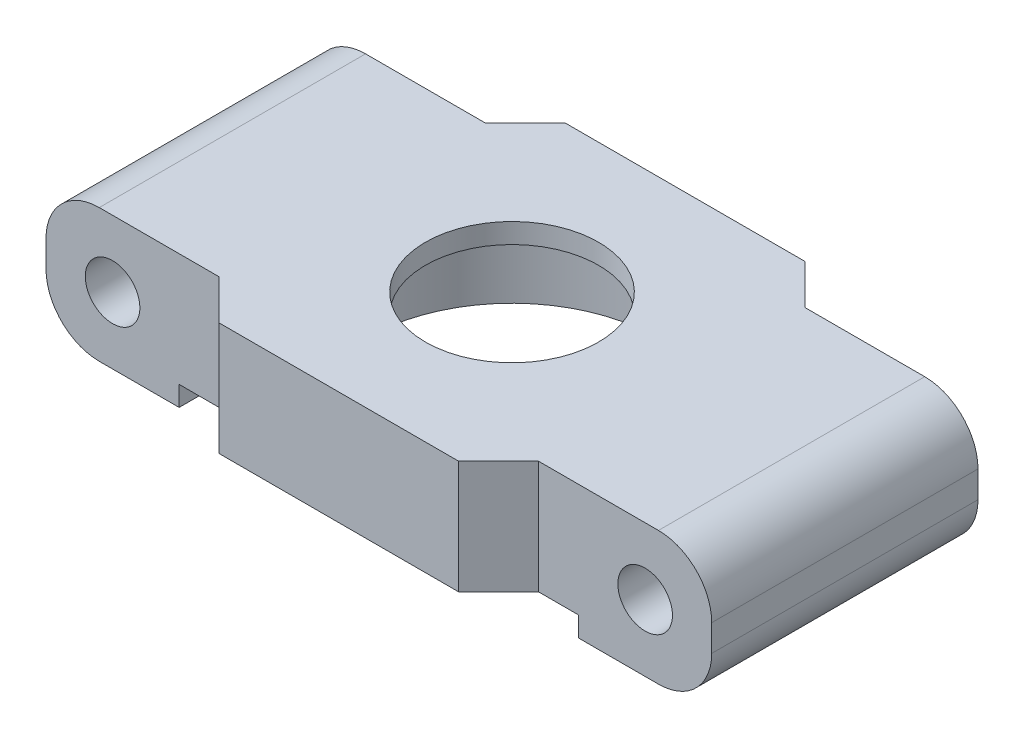
ISO-10303-21;
HEADER;
FILE_DESCRIPTION(('STEP AP214'),'2;1');
FILE_NAME('part.step','',(''),(''),'','','');
FILE_SCHEMA(('AUTOMOTIVE_DESIGN { 1 0 10303 214 1 1 1 1 }'));
ENDSEC;
DATA;
#1=APPLICATION_CONTEXT('core data for automotive mechanical design processes');
#2=APPLICATION_PROTOCOL_DEFINITION('international standard','automotive_design',2000,#1);
#3=PRODUCT_CONTEXT('',#1,'mechanical');
#4=PRODUCT('Part','Part','',(#3));
#5=PRODUCT_RELATED_PRODUCT_CATEGORY('part','',(#4));
#6=PRODUCT_DEFINITION_FORMATION('','',#4);
#7=PRODUCT_DEFINITION_CONTEXT('part definition',#1,'design');
#8=PRODUCT_DEFINITION('design','',#6,#7);
#9=PRODUCT_DEFINITION_SHAPE('','',#8);
#10=(LENGTH_UNIT() NAMED_UNIT(*) SI_UNIT(.MILLI.,.METRE.));
#11=(NAMED_UNIT(*) PLANE_ANGLE_UNIT() SI_UNIT($,.RADIAN.));
#12=(NAMED_UNIT(*) SI_UNIT($,.STERADIAN.) SOLID_ANGLE_UNIT());
#13=UNCERTAINTY_MEASURE_WITH_UNIT(LENGTH_MEASURE(1.E-05),#10,'distance_accuracy_value','');
#14=(GEOMETRIC_REPRESENTATION_CONTEXT(3) GLOBAL_UNCERTAINTY_ASSIGNED_CONTEXT((#13)) GLOBAL_UNIT_ASSIGNED_CONTEXT((#10,
#11,#12)) REPRESENTATION_CONTEXT('',''));
#15=CARTESIAN_POINT('',(0.,0.,0.));
#16=DIRECTION('',(0.,0.,1.));
#17=DIRECTION('',(1.,0.,0.));
#18=AXIS2_PLACEMENT_3D('',#15,#16,#17);
#19=CARTESIAN_POINT('',(0.,3.5,-13.));
#20=DIRECTION('',(0.,0.,-1.));
#21=DIRECTION('',(-1.,0.,0.));
#22=AXIS2_PLACEMENT_3D('',#19,#20,#21);
#23=PLANE('',#22);
#24=DIRECTION('',(0.,1.,0.));
#25=VECTOR('',#24,1.);
#26=CARTESIAN_POINT('',(-8.99999999999996,3.5,-13.));
#27=LINE('',#26,#25);
#28=CARTESIAN_POINT('',(-8.99999999999996,-3.5,-13.));
#29=VERTEX_POINT('',#28);
#30=CARTESIAN_POINT('',(-8.99999999999996,5.,-13.));
#31=VERTEX_POINT('',#30);
#32=EDGE_CURVE('E340',#29,#31,#27,.T.);
#33=ORIENTED_EDGE('',*,*,#32,.T.);
#34=DIRECTION('',(-1.,0.,0.));
#35=VECTOR('',#34,1.);
#36=CARTESIAN_POINT('',(8.99999999999989,5.,-13.));
#37=LINE('',#36,#35);
#38=CARTESIAN_POINT('',(8.99999999999989,5.,-13.));
#39=VERTEX_POINT('',#38);
#40=EDGE_CURVE('E223',#39,#31,#37,.T.);
#41=ORIENTED_EDGE('',*,*,#40,.F.);
#42=DIRECTION('',(0.,-1.,0.));
#43=VECTOR('',#42,1.);
#44=CARTESIAN_POINT('',(8.99999999999989,3.5,-13.));
#45=LINE('',#44,#43);
#46=CARTESIAN_POINT('',(8.99999999999989,-3.5,-13.));
#47=VERTEX_POINT('',#46);
#48=EDGE_CURVE('E342',#39,#47,#45,.T.);
#49=ORIENTED_EDGE('',*,*,#48,.T.);
#50=DIRECTION('',(1.,0.,0.));
#51=VECTOR('',#50,1.);
#52=CARTESIAN_POINT('',(0.,-3.5,-13.));
#53=LINE('',#52,#51);
#54=EDGE_CURVE('E296',#29,#47,#53,.T.);
#55=ORIENTED_EDGE('',*,*,#54,.F.);
#56=EDGE_LOOP('',(#33,#41,#49,#55));
#57=FACE_BOUND('',#56,.T.);
#58=ADVANCED_FACE('F45',(#57),#23,.T.);
#59=CARTESIAN_POINT('',(0.,3.5,0.));
#60=DIRECTION('',(0.,-1.,0.));
#61=DIRECTION('',(0.,0.,-1.));
#62=AXIS2_PLACEMENT_3D('',#59,#60,#61);
#63=CYLINDRICAL_SURFACE('',#62,11.);
#64=CARTESIAN_POINT('',(0.,3.5,0.));
#65=DIRECTION('',(0.,1.,0.));
#66=DIRECTION('',(0.,0.,1.));
#67=AXIS2_PLACEMENT_3D('',#64,#65,#66);
#68=CIRCLE('',#67,11.);
#69=CARTESIAN_POINT('',(0.,3.5,11.));
#70=VERTEX_POINT('',#69);
#71=EDGE_CURVE('E231',#70,#70,#68,.T.);
#72=ORIENTED_EDGE('',*,*,#71,.T.);
#73=EDGE_LOOP('',(#72));
#74=FACE_BOUND('',#73,.T.);
#75=CARTESIAN_POINT('',(0.,-3.5,0.));
#76=DIRECTION('',(0.,1.,0.));
#77=DIRECTION('',(0.,0.,1.));
#78=AXIS2_PLACEMENT_3D('',#75,#76,#77);
#79=CIRCLE('',#78,11.);
#80=CARTESIAN_POINT('',(0.,-3.5,11.));
#81=VERTEX_POINT('',#80);
#82=EDGE_CURVE('E271',#81,#81,#79,.T.);
#83=ORIENTED_EDGE('',*,*,#82,.F.);
#84=EDGE_LOOP('',(#83));
#85=FACE_BOUND('',#84,.T.);
#86=ADVANCED_FACE('F402',(#74,#85),#63,.F.);
#87=CARTESIAN_POINT('',(0.,3.5,13.));
#88=DIRECTION('',(0.,0.,-1.));
#89=DIRECTION('',(-1.,0.,0.));
#90=AXIS2_PLACEMENT_3D('',#87,#88,#89);
#91=PLANE('',#90);
#92=DIRECTION('',(1.,0.,0.));
#93=VECTOR('',#92,1.);
#94=CARTESIAN_POINT('',(0.,-3.5,13.));
#95=LINE('',#94,#93);
#96=CARTESIAN_POINT('',(-8.9999999999999,-3.5,13.));
#97=VERTEX_POINT('',#96);
#98=CARTESIAN_POINT('',(8.99999999999996,-3.5,13.));
#99=VERTEX_POINT('',#98);
#100=EDGE_CURVE('E302',#97,#99,#95,.T.);
#101=ORIENTED_EDGE('',*,*,#100,.T.);
#102=DIRECTION('',(0.,1.,0.));
#103=VECTOR('',#102,1.);
#104=CARTESIAN_POINT('',(8.99999999999996,3.5,13.));
#105=LINE('',#104,#103);
#106=CARTESIAN_POINT('',(8.99999999999996,5.,13.));
#107=VERTEX_POINT('',#106);
#108=EDGE_CURVE('E362',#99,#107,#105,.T.);
#109=ORIENTED_EDGE('',*,*,#108,.T.);
#110=DIRECTION('',(1.,0.,0.));
#111=VECTOR('',#110,1.);
#112=CARTESIAN_POINT('',(-8.9999999999999,5.,13.));
#113=LINE('',#112,#111);
#114=CARTESIAN_POINT('',(-8.9999999999999,5.,13.));
#115=VERTEX_POINT('',#114);
#116=EDGE_CURVE('E211',#115,#107,#113,.T.);
#117=ORIENTED_EDGE('',*,*,#116,.F.);
#118=DIRECTION('',(0.,-1.,0.));
#119=VECTOR('',#118,1.);
#120=CARTESIAN_POINT('',(-8.9999999999999,3.5,13.));
#121=LINE('',#120,#119);
#122=EDGE_CURVE('E359',#115,#97,#121,.T.);
#123=ORIENTED_EDGE('',*,*,#122,.T.);
#124=EDGE_LOOP('',(#101,#109,#117,#123));
#125=FACE_BOUND('',#124,.T.);
#126=ADVANCED_FACE('F400',(#125),#91,.F.);
#127=CARTESIAN_POINT('',(0.,-3.5,0.));
#128=DIRECTION('',(0.,1.,0.));
#129=DIRECTION('',(0.,0.,1.));
#130=AXIS2_PLACEMENT_3D('',#127,#128,#129);
#131=PLANE('',#130);
#132=ORIENTED_EDGE('',*,*,#82,.T.);
#133=EDGE_LOOP('',(#132));
#134=FACE_BOUND('',#133,.T.);
#135=DIRECTION('',(-0.707106781186551,0.,-0.707106781186544));
#136=VECTOR('',#135,1.);
#137=CARTESIAN_POINT('',(8.99999999999989,-3.5,-13.));
#138=LINE('',#137,#136);
#139=CARTESIAN_POINT('',(11.9999999999999,-3.5,-10.));
#140=VERTEX_POINT('',#139);
#141=EDGE_CURVE('E356',#47,#140,#138,.F.);
#142=ORIENTED_EDGE('',*,*,#141,.T.);
#143=DIRECTION('',(1.,0.,0.));
#144=VECTOR('',#143,1.);
#145=CARTESIAN_POINT('',(0.,-3.5,-10.));
#146=LINE('',#145,#144);
#147=CARTESIAN_POINT('',(15.,-3.5,-10.));
#148=VERTEX_POINT('',#147);
#149=EDGE_CURVE('E74',#140,#148,#146,.T.);
#150=ORIENTED_EDGE('',*,*,#149,.T.);
#151=DIRECTION('',(0.,0.,1.));
#152=VECTOR('',#151,1.);
#153=CARTESIAN_POINT('',(15.,-3.5,0.));
#154=LINE('',#153,#152);
#155=CARTESIAN_POINT('',(15.,-3.5,10.));
#156=VERTEX_POINT('',#155);
#157=EDGE_CURVE('E293',#148,#156,#154,.T.);
#158=ORIENTED_EDGE('',*,*,#157,.T.);
#159=DIRECTION('',(-1.,0.,0.));
#160=VECTOR('',#159,1.);
#161=CARTESIAN_POINT('',(0.,-3.5,10.));
#162=LINE('',#161,#160);
#163=CARTESIAN_POINT('',(11.9999999999999,-3.5,10.));
#164=VERTEX_POINT('',#163);
#165=EDGE_CURVE('E354',#156,#164,#162,.T.);
#166=ORIENTED_EDGE('',*,*,#165,.T.);
#167=DIRECTION('',(-0.707106781186544,0.,0.707106781186551));
#168=VECTOR('',#167,1.);
#169=CARTESIAN_POINT('',(15.,-3.5,6.99999999999989));
#170=LINE('',#169,#168);
#171=EDGE_CURVE('E203',#164,#99,#170,.T.);
#172=ORIENTED_EDGE('',*,*,#171,.T.);
#173=ORIENTED_EDGE('',*,*,#100,.F.);
#174=DIRECTION('',(0.707106781186551,0.,0.707106781186544));
#175=VECTOR('',#174,1.);
#176=CARTESIAN_POINT('',(-8.9999999999999,-3.5,13.));
#177=LINE('',#176,#175);
#178=CARTESIAN_POINT('',(-11.9999999999999,-3.5,10.));
#179=VERTEX_POINT('',#178);
#180=EDGE_CURVE('E348',#97,#179,#177,.F.);
#181=ORIENTED_EDGE('',*,*,#180,.T.);
#182=DIRECTION('',(-1.,0.,0.));
#183=VECTOR('',#182,1.);
#184=CARTESIAN_POINT('',(0.,-3.5,10.));
#185=LINE('',#184,#183);
#186=CARTESIAN_POINT('',(-15.,-3.5,10.));
#187=VERTEX_POINT('',#186);
#188=EDGE_CURVE('E351',#179,#187,#185,.T.);
#189=ORIENTED_EDGE('',*,*,#188,.T.);
#190=DIRECTION('',(0.,0.,1.));
#191=VECTOR('',#190,1.);
#192=CARTESIAN_POINT('',(-15.,-3.5,0.));
#193=LINE('',#192,#191);
#194=CARTESIAN_POINT('',(-15.,-3.5,-10.));
#195=VERTEX_POINT('',#194);
#196=EDGE_CURVE('E299',#195,#187,#193,.T.);
#197=ORIENTED_EDGE('',*,*,#196,.F.);
#198=DIRECTION('',(1.,0.,0.));
#199=VECTOR('',#198,1.);
#200=CARTESIAN_POINT('',(0.,-3.5,-10.));
#201=LINE('',#200,#199);
#202=CARTESIAN_POINT('',(-11.9999999999999,-3.5,-10.));
#203=VERTEX_POINT('',#202);
#204=EDGE_CURVE('E62',#195,#203,#201,.T.);
#205=ORIENTED_EDGE('',*,*,#204,.T.);
#206=DIRECTION('',(0.707106781186544,0.,-0.707106781186551));
#207=VECTOR('',#206,1.);
#208=CARTESIAN_POINT('',(-15.,-3.5,-6.99999999999989));
#209=LINE('',#208,#207);
#210=EDGE_CURVE('E345',#203,#29,#209,.T.);
#211=ORIENTED_EDGE('',*,*,#210,.T.);
#212=ORIENTED_EDGE('',*,*,#54,.T.);
#213=EDGE_LOOP('',(#142,#150,#158,#166,#172,#173,#181,#189,#197,#205,#211,#212));
#214=FACE_BOUND('',#213,.T.);
#215=ADVANCED_FACE('F396',(#134,#214),#131,.F.);
#216=CARTESIAN_POINT('',(-25.,5.,0.));
#217=DIRECTION('',(1.,0.,0.));
#218=DIRECTION('',(0.,0.,-1.));
#219=AXIS2_PLACEMENT_3D('',#216,#217,#218);
#220=PLANE('',#219);
#221=DIRECTION('',(0.,-1.,0.));
#222=VECTOR('',#221,1.);
#223=CARTESIAN_POINT('',(-25.,5.,-10.));
#224=LINE('',#223,#222);
#225=CARTESIAN_POINT('',(-25.,1.,-10.));
#226=VERTEX_POINT('',#225);
#227=CARTESIAN_POINT('',(-25.,-1.,-10.));
#228=VERTEX_POINT('',#227);
#229=EDGE_CURVE('E253',#226,#228,#224,.T.);
#230=ORIENTED_EDGE('',*,*,#229,.T.);
#231=DIRECTION('',(0.,0.,1.));
#232=VECTOR('',#231,1.);
#233=CARTESIAN_POINT('',(-25.,-1.,0.));
#234=LINE('',#233,#232);
#235=CARTESIAN_POINT('',(-25.,-1.,10.));
#236=VERTEX_POINT('',#235);
#237=EDGE_CURVE('E324',#228,#236,#234,.T.);
#238=ORIENTED_EDGE('',*,*,#237,.T.);
#239=DIRECTION('',(0.,-1.,0.));
#240=VECTOR('',#239,1.);
#241=CARTESIAN_POINT('',(-25.,5.,10.));
#242=LINE('',#241,#240);
#243=CARTESIAN_POINT('',(-25.,1.,10.));
#244=VERTEX_POINT('',#243);
#245=EDGE_CURVE('E269',#244,#236,#242,.T.);
#246=ORIENTED_EDGE('',*,*,#245,.F.);
#247=DIRECTION('',(0.,0.,1.));
#248=VECTOR('',#247,1.);
#249=CARTESIAN_POINT('',(-25.,1.,-10.));
#250=LINE('',#249,#248);
#251=EDGE_CURVE('E322',#244,#226,#250,.F.);
#252=ORIENTED_EDGE('',*,*,#251,.T.);
#253=EDGE_LOOP('',(#230,#238,#246,#252));
#254=FACE_BOUND('',#253,.T.);
#255=ADVANCED_FACE('F380',(#254),#220,.F.);
#256=CARTESIAN_POINT('',(0.,5.,10.));
#257=DIRECTION('',(0.,0.,-1.));
#258=DIRECTION('',(-1.,0.,0.));
#259=AXIS2_PLACEMENT_3D('',#256,#257,#258);
#260=PLANE('',#259);
#261=CARTESIAN_POINT('',(-20.,0.,10.));
#262=DIRECTION('',(0.,0.,-1.));
#263=DIRECTION('',(-1.,0.,0.));
#264=AXIS2_PLACEMENT_3D('',#261,#262,#263);
#265=CIRCLE('',#264,2.05);
#266=CARTESIAN_POINT('',(-22.05,0.,10.));
#267=VERTEX_POINT('',#266);
#268=EDGE_CURVE('E244',#267,#267,#265,.T.);
#269=ORIENTED_EDGE('',*,*,#268,.T.);
#270=EDGE_LOOP('',(#269));
#271=FACE_BOUND('',#270,.T.);
#272=ORIENTED_EDGE('',*,*,#245,.T.);
#273=CARTESIAN_POINT('',(-21.,-1.,10.));
#274=DIRECTION('',(0.,0.,-1.));
#275=DIRECTION('',(-1.,0.,0.));
#276=AXIS2_PLACEMENT_3D('',#273,#274,#275);
#277=CIRCLE('',#276,4.);
#278=CARTESIAN_POINT('',(-21.,-5.,10.));
#279=VERTEX_POINT('',#278);
#280=EDGE_CURVE('E329',#236,#279,#277,.F.);
#281=ORIENTED_EDGE('',*,*,#280,.T.);
#282=DIRECTION('',(1.,0.,0.));
#283=VECTOR('',#282,1.);
#284=CARTESIAN_POINT('',(0.,-5.,10.));
#285=LINE('',#284,#283);
#286=CARTESIAN_POINT('',(-15.,-5.,10.));
#287=VERTEX_POINT('',#286);
#288=EDGE_CURVE('E254',#279,#287,#285,.T.);
#289=ORIENTED_EDGE('',*,*,#288,.T.);
#290=DIRECTION('',(0.,-1.,0.));
#291=VECTOR('',#290,1.);
#292=CARTESIAN_POINT('',(-15.,5.,10.));
#293=LINE('',#292,#291);
#294=EDGE_CURVE('E266',#187,#287,#293,.T.);
#295=ORIENTED_EDGE('',*,*,#294,.F.);
#296=ORIENTED_EDGE('',*,*,#188,.F.);
#297=DIRECTION('',(0.,-1.,0.));
#298=VECTOR('',#297,1.);
#299=CARTESIAN_POINT('',(-11.9999999999999,5.,10.));
#300=LINE('',#299,#298);
#301=CARTESIAN_POINT('',(-11.9999999999999,5.,10.));
#302=VERTEX_POINT('',#301);
#303=EDGE_CURVE('E55',#179,#302,#300,.F.);
#304=ORIENTED_EDGE('',*,*,#303,.T.);
#305=DIRECTION('',(1.,0.,0.));
#306=VECTOR('',#305,1.);
#307=CARTESIAN_POINT('',(0.,5.,10.));
#308=LINE('',#307,#306);
#309=CARTESIAN_POINT('',(-21.,5.,10.));
#310=VERTEX_POINT('',#309);
#311=EDGE_CURVE('E248',#310,#302,#308,.T.);
#312=ORIENTED_EDGE('',*,*,#311,.F.);
#313=CARTESIAN_POINT('',(-21.,1.,10.));
#314=DIRECTION('',(0.,0.,-1.));
#315=DIRECTION('',(-1.,0.,0.));
#316=AXIS2_PLACEMENT_3D('',#313,#314,#315);
#317=CIRCLE('',#316,4.);
#318=EDGE_CURVE('E327',#310,#244,#317,.F.);
#319=ORIENTED_EDGE('',*,*,#318,.T.);
#320=EDGE_LOOP('',(#272,#281,#289,#295,#296,#304,#312,#319));
#321=FACE_BOUND('',#320,.T.);
#322=ADVANCED_FACE('F369',(#271,#321),#260,.F.);
#323=CARTESIAN_POINT('',(-15.,5.,0.));
#324=DIRECTION('',(1.,0.,0.));
#325=DIRECTION('',(0.,0.,-1.));
#326=AXIS2_PLACEMENT_3D('',#323,#324,#325);
#327=PLANE('',#326);
#328=DIRECTION('',(0.,-1.,0.));
#329=VECTOR('',#328,1.);
#330=CARTESIAN_POINT('',(-15.,5.,-10.));
#331=LINE('',#330,#329);
#332=CARTESIAN_POINT('',(-15.,-5.,-10.));
#333=VERTEX_POINT('',#332);
#334=EDGE_CURVE('E264',#195,#333,#331,.T.);
#335=ORIENTED_EDGE('',*,*,#334,.F.);
#336=ORIENTED_EDGE('',*,*,#196,.T.);
#337=ORIENTED_EDGE('',*,*,#294,.T.);
#338=DIRECTION('',(0.,0.,1.));
#339=VECTOR('',#338,1.);
#340=CARTESIAN_POINT('',(-15.,-5.,0.));
#341=LINE('',#340,#339);
#342=EDGE_CURVE('E256',#333,#287,#341,.T.);
#343=ORIENTED_EDGE('',*,*,#342,.F.);
#344=EDGE_LOOP('',(#335,#336,#337,#343));
#345=FACE_BOUND('',#344,.T.);
#346=ADVANCED_FACE('F394',(#345),#327,.T.);
#347=CARTESIAN_POINT('',(0.,5.,-10.));
#348=DIRECTION('',(0.,0.,1.));
#349=DIRECTION('',(1.,0.,0.));
#350=AXIS2_PLACEMENT_3D('',#347,#348,#349);
#351=PLANE('',#350);
#352=CARTESIAN_POINT('',(-20.,0.,-10.));
#353=DIRECTION('',(0.,0.,-1.));
#354=DIRECTION('',(-1.,0.,0.));
#355=AXIS2_PLACEMENT_3D('',#352,#353,#354);
#356=CIRCLE('',#355,2.05);
#357=CARTESIAN_POINT('',(-22.05,0.,-10.));
#358=VERTEX_POINT('',#357);
#359=EDGE_CURVE('E236',#358,#358,#356,.T.);
#360=ORIENTED_EDGE('',*,*,#359,.F.);
#361=EDGE_LOOP('',(#360));
#362=FACE_BOUND('',#361,.T.);
#363=DIRECTION('',(-1.,0.,0.));
#364=VECTOR('',#363,1.);
#365=CARTESIAN_POINT('',(0.,-5.,-10.));
#366=LINE('',#365,#364);
#367=CARTESIAN_POINT('',(-21.,-5.,-10.));
#368=VERTEX_POINT('',#367);
#369=EDGE_CURVE('E251',#333,#368,#366,.T.);
#370=ORIENTED_EDGE('',*,*,#369,.T.);
#371=CARTESIAN_POINT('',(-21.,-1.,-10.));
#372=DIRECTION('',(0.,0.,1.));
#373=DIRECTION('',(1.,0.,0.));
#374=AXIS2_PLACEMENT_3D('',#371,#372,#373);
#375=CIRCLE('',#374,4.);
#376=EDGE_CURVE('E335',#368,#228,#375,.F.);
#377=ORIENTED_EDGE('',*,*,#376,.T.);
#378=ORIENTED_EDGE('',*,*,#229,.F.);
#379=CARTESIAN_POINT('',(-21.,1.,-10.));
#380=DIRECTION('',(0.,0.,1.));
#381=DIRECTION('',(1.,0.,0.));
#382=AXIS2_PLACEMENT_3D('',#379,#380,#381);
#383=CIRCLE('',#382,4.);
#384=CARTESIAN_POINT('',(-21.,5.,-10.));
#385=VERTEX_POINT('',#384);
#386=EDGE_CURVE('E333',#226,#385,#383,.F.);
#387=ORIENTED_EDGE('',*,*,#386,.T.);
#388=DIRECTION('',(-1.,0.,0.));
#389=VECTOR('',#388,1.);
#390=CARTESIAN_POINT('',(0.,5.,-10.));
#391=LINE('',#390,#389);
#392=CARTESIAN_POINT('',(-11.9999999999999,5.,-10.));
#393=VERTEX_POINT('',#392);
#394=EDGE_CURVE('E250',#393,#385,#391,.T.);
#395=ORIENTED_EDGE('',*,*,#394,.F.);
#396=DIRECTION('',(0.,-1.,0.));
#397=VECTOR('',#396,1.);
#398=CARTESIAN_POINT('',(-11.9999999999999,5.,-10.));
#399=LINE('',#398,#397);
#400=EDGE_CURVE('E11',#393,#203,#399,.T.);
#401=ORIENTED_EDGE('',*,*,#400,.T.);
#402=ORIENTED_EDGE('',*,*,#204,.F.);
#403=ORIENTED_EDGE('',*,*,#334,.T.);
#404=EDGE_LOOP('',(#370,#377,#378,#387,#395,#401,#402,#403));
#405=FACE_BOUND('',#404,.T.);
#406=ADVANCED_FACE('F515',(#362,#405),#351,.F.);
#407=CARTESIAN_POINT('',(0.,5.,0.));
#408=DIRECTION('',(0.,1.,0.));
#409=DIRECTION('',(0.,0.,1.));
#410=AXIS2_PLACEMENT_3D('',#407,#408,#409);
#411=PLANE('',#410);
#412=ORIENTED_EDGE('',*,*,#394,.T.);
#413=DIRECTION('',(0.,0.,1.));
#414=VECTOR('',#413,1.);
#415=CARTESIAN_POINT('',(-21.,5.,10.));
#416=LINE('',#415,#414);
#417=EDGE_CURVE('E337',#385,#310,#416,.T.);
#418=ORIENTED_EDGE('',*,*,#417,.T.);
#419=ORIENTED_EDGE('',*,*,#311,.T.);
#420=DIRECTION('',(0.707106781186551,0.,0.707106781186544));
#421=VECTOR('',#420,1.);
#422=CARTESIAN_POINT('',(-11.9999999999999,5.,10.));
#423=LINE('',#422,#421);
#424=EDGE_CURVE('E214',#302,#115,#423,.T.);
#425=ORIENTED_EDGE('',*,*,#424,.T.);
#426=ORIENTED_EDGE('',*,*,#116,.T.);
#427=DIRECTION('',(0.707106781186544,0.,-0.707106781186551));
#428=VECTOR('',#427,1.);
#429=CARTESIAN_POINT('',(8.99999999999996,5.,13.));
#430=LINE('',#429,#428);
#431=CARTESIAN_POINT('',(11.9999999999999,5.,10.));
#432=VERTEX_POINT('',#431);
#433=EDGE_CURVE('E201',#107,#432,#430,.T.);
#434=ORIENTED_EDGE('',*,*,#433,.T.);
#435=DIRECTION('',(-1.,0.,0.));
#436=VECTOR('',#435,1.);
#437=CARTESIAN_POINT('',(0.,5.,10.));
#438=LINE('',#437,#436);
#439=CARTESIAN_POINT('',(21.,5.,10.));
#440=VERTEX_POINT('',#439);
#441=EDGE_CURVE('E185',#440,#432,#438,.T.);
#442=ORIENTED_EDGE('',*,*,#441,.F.);
#443=DIRECTION('',(0.,0.,1.));
#444=VECTOR('',#443,1.);
#445=CARTESIAN_POINT('',(21.,5.,0.));
#446=LINE('',#445,#444);
#447=CARTESIAN_POINT('',(21.,5.,-10.));
#448=VERTEX_POINT('',#447);
#449=EDGE_CURVE('E320',#440,#448,#446,.F.);
#450=ORIENTED_EDGE('',*,*,#449,.T.);
#451=DIRECTION('',(1.,0.,0.));
#452=VECTOR('',#451,1.);
#453=CARTESIAN_POINT('',(0.,5.,-10.));
#454=LINE('',#453,#452);
#455=CARTESIAN_POINT('',(11.9999999999999,5.,-10.));
#456=VERTEX_POINT('',#455);
#457=EDGE_CURVE('E193',#456,#448,#454,.T.);
#458=ORIENTED_EDGE('',*,*,#457,.F.);
#459=DIRECTION('',(-0.707106781186551,0.,-0.707106781186544));
#460=VECTOR('',#459,1.);
#461=CARTESIAN_POINT('',(11.9999999999999,5.,-10.));
#462=LINE('',#461,#460);
#463=EDGE_CURVE('E226',#456,#39,#462,.T.);
#464=ORIENTED_EDGE('',*,*,#463,.T.);
#465=ORIENTED_EDGE('',*,*,#40,.T.);
#466=DIRECTION('',(-0.707106781186544,0.,0.707106781186551));
#467=VECTOR('',#466,1.);
#468=CARTESIAN_POINT('',(-8.99999999999996,5.,-13.));
#469=LINE('',#468,#467);
#470=EDGE_CURVE('E220',#31,#393,#469,.T.);
#471=ORIENTED_EDGE('',*,*,#470,.T.);
#472=EDGE_LOOP('',(#412,#418,#419,#425,#426,#434,#442,#450,#458,#464,#465,#471));
#473=FACE_BOUND('',#472,.T.);
#474=CARTESIAN_POINT('',(0.,5.,0.));
#475=DIRECTION('',(0.,1.,0.));
#476=DIRECTION('',(0.,0.,1.));
#477=AXIS2_PLACEMENT_3D('',#474,#475,#476);
#478=CIRCLE('',#477,6.5);
#479=CARTESIAN_POINT('',(0.,5.,6.5));
#480=VERTEX_POINT('',#479);
#481=EDGE_CURVE('E212',#480,#480,#478,.T.);
#482=ORIENTED_EDGE('',*,*,#481,.F.);
#483=EDGE_LOOP('',(#482));
#484=FACE_BOUND('',#483,.T.);
#485=ADVANCED_FACE('F207',(#473,#484),#411,.T.);
#486=CARTESIAN_POINT('',(0.,-5.,0.));
#487=DIRECTION('',(0.,1.,0.));
#488=DIRECTION('',(0.,0.,1.));
#489=AXIS2_PLACEMENT_3D('',#486,#487,#488);
#490=PLANE('',#489);
#491=ORIENTED_EDGE('',*,*,#288,.F.);
#492=DIRECTION('',(0.,0.,1.));
#493=VECTOR('',#492,1.);
#494=CARTESIAN_POINT('',(-21.,-5.,0.));
#495=LINE('',#494,#493);
#496=EDGE_CURVE('E331',#279,#368,#495,.F.);
#497=ORIENTED_EDGE('',*,*,#496,.T.);
#498=ORIENTED_EDGE('',*,*,#369,.F.);
#499=ORIENTED_EDGE('',*,*,#342,.T.);
#500=EDGE_LOOP('',(#491,#497,#498,#499));
#501=FACE_BOUND('',#500,.T.);
#502=ADVANCED_FACE('F389',(#501),#490,.F.);
#503=CARTESIAN_POINT('',(0.,5.,10.));
#504=DIRECTION('',(0.,0.,1.));
#505=DIRECTION('',(1.,0.,0.));
#506=AXIS2_PLACEMENT_3D('',#503,#504,#505);
#507=PLANE('',#506);
#508=CARTESIAN_POINT('',(20.,0.,10.));
#509=DIRECTION('',(0.,0.,1.));
#510=DIRECTION('',(1.,0.,0.));
#511=AXIS2_PLACEMENT_3D('',#508,#509,#510);
#512=CIRCLE('',#511,2.05);
#513=CARTESIAN_POINT('',(22.05,0.,10.));
#514=VERTEX_POINT('',#513);
#515=EDGE_CURVE('E239',#514,#514,#512,.T.);
#516=ORIENTED_EDGE('',*,*,#515,.F.);
#517=EDGE_LOOP('',(#516));
#518=FACE_BOUND('',#517,.T.);
#519=DIRECTION('',(-1.,0.,0.));
#520=VECTOR('',#519,1.);
#521=CARTESIAN_POINT('',(0.,-5.,10.));
#522=LINE('',#521,#520);
#523=CARTESIAN_POINT('',(21.,-5.,10.));
#524=VERTEX_POINT('',#523);
#525=CARTESIAN_POINT('',(15.,-5.,10.));
#526=VERTEX_POINT('',#525);
#527=EDGE_CURVE('E247',#524,#526,#522,.T.);
#528=ORIENTED_EDGE('',*,*,#527,.F.);
#529=CARTESIAN_POINT('',(21.,-1.,10.));
#530=DIRECTION('',(0.,0.,1.));
#531=DIRECTION('',(1.,0.,0.));
#532=AXIS2_PLACEMENT_3D('',#529,#530,#531);
#533=CIRCLE('',#532,4.);
#534=CARTESIAN_POINT('',(25.,-1.,10.));
#535=VERTEX_POINT('',#534);
#536=EDGE_CURVE('E309',#524,#535,#533,.T.);
#537=ORIENTED_EDGE('',*,*,#536,.T.);
#538=DIRECTION('',(0.,-1.,0.));
#539=VECTOR('',#538,1.);
#540=CARTESIAN_POINT('',(25.,5.,10.));
#541=LINE('',#540,#539);
#542=CARTESIAN_POINT('',(25.,1.,10.));
#543=VERTEX_POINT('',#542);
#544=EDGE_CURVE('E257',#543,#535,#541,.T.);
#545=ORIENTED_EDGE('',*,*,#544,.F.);
#546=CARTESIAN_POINT('',(21.,1.,10.));
#547=DIRECTION('',(0.,0.,1.));
#548=DIRECTION('',(1.,0.,0.));
#549=AXIS2_PLACEMENT_3D('',#546,#547,#548);
#550=CIRCLE('',#549,4.);
#551=EDGE_CURVE('E189',#543,#440,#550,.T.);
#552=ORIENTED_EDGE('',*,*,#551,.T.);
#553=ORIENTED_EDGE('',*,*,#441,.T.);
#554=DIRECTION('',(0.,-1.,0.));
#555=VECTOR('',#554,1.);
#556=CARTESIAN_POINT('',(11.9999999999999,3.5,10.));
#557=LINE('',#556,#555);
#558=EDGE_CURVE('E80',#432,#164,#557,.T.);
#559=ORIENTED_EDGE('',*,*,#558,.T.);
#560=ORIENTED_EDGE('',*,*,#165,.F.);
#561=DIRECTION('',(0.,-1.,0.));
#562=VECTOR('',#561,1.);
#563=CARTESIAN_POINT('',(15.,5.,10.));
#564=LINE('',#563,#562);
#565=EDGE_CURVE('E275',#156,#526,#564,.T.);
#566=ORIENTED_EDGE('',*,*,#565,.T.);
#567=EDGE_LOOP('',(#528,#537,#545,#552,#553,#559,#560,#566));
#568=FACE_BOUND('',#567,.T.);
#569=ADVANCED_FACE('F187',(#518,#568),#507,.T.);
#570=CARTESIAN_POINT('',(25.,5.,0.));
#571=DIRECTION('',(1.,0.,0.));
#572=DIRECTION('',(0.,0.,-1.));
#573=AXIS2_PLACEMENT_3D('',#570,#571,#572);
#574=PLANE('',#573);
#575=ORIENTED_EDGE('',*,*,#544,.T.);
#576=DIRECTION('',(0.,0.,1.));
#577=VECTOR('',#576,1.);
#578=CARTESIAN_POINT('',(25.,-1.,-10.));
#579=LINE('',#578,#577);
#580=CARTESIAN_POINT('',(25.,-1.,-10.));
#581=VERTEX_POINT('',#580);
#582=EDGE_CURVE('E314',#535,#581,#579,.F.);
#583=ORIENTED_EDGE('',*,*,#582,.T.);
#584=DIRECTION('',(0.,-1.,0.));
#585=VECTOR('',#584,1.);
#586=CARTESIAN_POINT('',(25.,5.,-10.));
#587=LINE('',#586,#585);
#588=CARTESIAN_POINT('',(25.,1.,-10.));
#589=VERTEX_POINT('',#588);
#590=EDGE_CURVE('E286',#589,#581,#587,.T.);
#591=ORIENTED_EDGE('',*,*,#590,.F.);
#592=DIRECTION('',(0.,0.,1.));
#593=VECTOR('',#592,1.);
#594=CARTESIAN_POINT('',(25.,1.,0.));
#595=LINE('',#594,#593);
#596=EDGE_CURVE('E311',#589,#543,#595,.T.);
#597=ORIENTED_EDGE('',*,*,#596,.T.);
#598=EDGE_LOOP('',(#575,#583,#591,#597));
#599=FACE_BOUND('',#598,.T.);
#600=ADVANCED_FACE('F469',(#599),#574,.T.);
#601=CARTESIAN_POINT('',(0.,5.,-10.));
#602=DIRECTION('',(0.,0.,-1.));
#603=DIRECTION('',(-1.,0.,0.));
#604=AXIS2_PLACEMENT_3D('',#601,#602,#603);
#605=PLANE('',#604);
#606=CARTESIAN_POINT('',(20.,0.,-10.));
#607=DIRECTION('',(0.,0.,-1.));
#608=DIRECTION('',(-1.,0.,0.));
#609=AXIS2_PLACEMENT_3D('',#606,#607,#608);
#610=CIRCLE('',#609,2.05);
#611=CARTESIAN_POINT('',(17.95,0.,-10.));
#612=VERTEX_POINT('',#611);
#613=EDGE_CURVE('E235',#612,#612,#610,.T.);
#614=ORIENTED_EDGE('',*,*,#613,.F.);
#615=EDGE_LOOP('',(#614));
#616=FACE_BOUND('',#615,.T.);
#617=ORIENTED_EDGE('',*,*,#590,.T.);
#618=CARTESIAN_POINT('',(21.,-1.,-10.));
#619=DIRECTION('',(0.,0.,-1.));
#620=DIRECTION('',(-1.,0.,0.));
#621=AXIS2_PLACEMENT_3D('',#618,#619,#620);
#622=CIRCLE('',#621,4.);
#623=CARTESIAN_POINT('',(21.,-5.,-10.));
#624=VERTEX_POINT('',#623);
#625=EDGE_CURVE('E318',#581,#624,#622,.T.);
#626=ORIENTED_EDGE('',*,*,#625,.T.);
#627=DIRECTION('',(1.,0.,0.));
#628=VECTOR('',#627,1.);
#629=CARTESIAN_POINT('',(0.,-5.,-10.));
#630=LINE('',#629,#628);
#631=CARTESIAN_POINT('',(15.,-5.,-10.));
#632=VERTEX_POINT('',#631);
#633=EDGE_CURVE('E277',#632,#624,#630,.T.);
#634=ORIENTED_EDGE('',*,*,#633,.F.);
#635=DIRECTION('',(0.,-1.,0.));
#636=VECTOR('',#635,1.);
#637=CARTESIAN_POINT('',(15.,5.,-10.));
#638=LINE('',#637,#636);
#639=EDGE_CURVE('E284',#148,#632,#638,.T.);
#640=ORIENTED_EDGE('',*,*,#639,.F.);
#641=ORIENTED_EDGE('',*,*,#149,.F.);
#642=DIRECTION('',(0.,-1.,0.));
#643=VECTOR('',#642,1.);
#644=CARTESIAN_POINT('',(11.9999999999999,3.5,-10.));
#645=LINE('',#644,#643);
#646=EDGE_CURVE('E204',#140,#456,#645,.F.);
#647=ORIENTED_EDGE('',*,*,#646,.T.);
#648=ORIENTED_EDGE('',*,*,#457,.T.);
#649=CARTESIAN_POINT('',(21.,1.,-10.));
#650=DIRECTION('',(0.,0.,-1.));
#651=DIRECTION('',(-1.,0.,0.));
#652=AXIS2_PLACEMENT_3D('',#649,#650,#651);
#653=CIRCLE('',#652,4.);
#654=EDGE_CURVE('E316',#448,#589,#653,.T.);
#655=ORIENTED_EDGE('',*,*,#654,.T.);
#656=EDGE_LOOP('',(#617,#626,#634,#640,#641,#647,#648,#655));
#657=FACE_BOUND('',#656,.T.);
#658=ADVANCED_FACE('F464',(#616,#657),#605,.T.);
#659=CARTESIAN_POINT('',(15.,5.,0.));
#660=DIRECTION('',(1.,0.,0.));
#661=DIRECTION('',(0.,0.,-1.));
#662=AXIS2_PLACEMENT_3D('',#659,#660,#661);
#663=PLANE('',#662);
#664=ORIENTED_EDGE('',*,*,#157,.F.);
#665=ORIENTED_EDGE('',*,*,#639,.T.);
#666=DIRECTION('',(0.,0.,1.));
#667=VECTOR('',#666,1.);
#668=CARTESIAN_POINT('',(15.,-5.,0.));
#669=LINE('',#668,#667);
#670=EDGE_CURVE('E194',#632,#526,#669,.T.);
#671=ORIENTED_EDGE('',*,*,#670,.T.);
#672=ORIENTED_EDGE('',*,*,#565,.F.);
#673=EDGE_LOOP('',(#664,#665,#671,#672));
#674=FACE_BOUND('',#673,.T.);
#675=ADVANCED_FACE('F480',(#674),#663,.F.);
#676=CARTESIAN_POINT('',(0.,-5.,0.));
#677=DIRECTION('',(0.,1.,0.));
#678=DIRECTION('',(0.,0.,1.));
#679=AXIS2_PLACEMENT_3D('',#676,#677,#678);
#680=PLANE('',#679);
#681=ORIENTED_EDGE('',*,*,#633,.T.);
#682=DIRECTION('',(0.,0.,1.));
#683=VECTOR('',#682,1.);
#684=CARTESIAN_POINT('',(21.,-5.,10.));
#685=LINE('',#684,#683);
#686=EDGE_CURVE('E305',#624,#524,#685,.T.);
#687=ORIENTED_EDGE('',*,*,#686,.T.);
#688=ORIENTED_EDGE('',*,*,#527,.T.);
#689=ORIENTED_EDGE('',*,*,#670,.F.);
#690=EDGE_LOOP('',(#681,#687,#688,#689));
#691=FACE_BOUND('',#690,.T.);
#692=ADVANCED_FACE('F474',(#691),#680,.F.);
#693=CARTESIAN_POINT('',(20.,0.,20.));
#694=DIRECTION('',(0.,0.,-1.));
#695=DIRECTION('',(-1.,0.,0.));
#696=AXIS2_PLACEMENT_3D('',#693,#694,#695);
#697=CYLINDRICAL_SURFACE('',#696,2.05);
#698=ORIENTED_EDGE('',*,*,#515,.T.);
#699=EDGE_LOOP('',(#698));
#700=FACE_BOUND('',#699,.T.);
#701=ORIENTED_EDGE('',*,*,#613,.T.);
#702=EDGE_LOOP('',(#701));
#703=FACE_BOUND('',#702,.T.);
#704=ADVANCED_FACE('F488',(#700,#703),#697,.F.);
#705=CARTESIAN_POINT('',(-20.,0.,20.));
#706=DIRECTION('',(0.,0.,-1.));
#707=DIRECTION('',(-1.,0.,0.));
#708=AXIS2_PLACEMENT_3D('',#705,#706,#707);
#709=CYLINDRICAL_SURFACE('',#708,2.05);
#710=ORIENTED_EDGE('',*,*,#359,.T.);
#711=EDGE_LOOP('',(#710));
#712=FACE_BOUND('',#711,.T.);
#713=ORIENTED_EDGE('',*,*,#268,.F.);
#714=EDGE_LOOP('',(#713));
#715=FACE_BOUND('',#714,.T.);
#716=ADVANCED_FACE('F422',(#712,#715),#709,.F.);
#717=CARTESIAN_POINT('',(21.,-1.,0.));
#718=DIRECTION('',(0.,0.,-1.));
#719=DIRECTION('',(-1.,0.,0.));
#720=AXIS2_PLACEMENT_3D('',#717,#718,#719);
#721=CYLINDRICAL_SURFACE('',#720,4.);
#722=ORIENTED_EDGE('',*,*,#625,.F.);
#723=ORIENTED_EDGE('',*,*,#582,.F.);
#724=ORIENTED_EDGE('',*,*,#536,.F.);
#725=ORIENTED_EDGE('',*,*,#686,.F.);
#726=EDGE_LOOP('',(#722,#723,#724,#725));
#727=FACE_BOUND('',#726,.T.);
#728=ADVANCED_FACE('F418',(#727),#721,.T.);
#729=CARTESIAN_POINT('',(21.,1.,0.));
#730=DIRECTION('',(0.,0.,1.));
#731=DIRECTION('',(1.,0.,0.));
#732=AXIS2_PLACEMENT_3D('',#729,#730,#731);
#733=CYLINDRICAL_SURFACE('',#732,4.);
#734=ORIENTED_EDGE('',*,*,#654,.F.);
#735=ORIENTED_EDGE('',*,*,#449,.F.);
#736=ORIENTED_EDGE('',*,*,#551,.F.);
#737=ORIENTED_EDGE('',*,*,#596,.F.);
#738=EDGE_LOOP('',(#734,#735,#736,#737));
#739=FACE_BOUND('',#738,.T.);
#740=ADVANCED_FACE('F421',(#739),#733,.T.);
#741=CARTESIAN_POINT('',(-21.,-1.,0.));
#742=DIRECTION('',(0.,0.,1.));
#743=DIRECTION('',(1.,0.,0.));
#744=AXIS2_PLACEMENT_3D('',#741,#742,#743);
#745=CYLINDRICAL_SURFACE('',#744,4.);
#746=ORIENTED_EDGE('',*,*,#376,.F.);
#747=ORIENTED_EDGE('',*,*,#496,.F.);
#748=ORIENTED_EDGE('',*,*,#280,.F.);
#749=ORIENTED_EDGE('',*,*,#237,.F.);
#750=EDGE_LOOP('',(#746,#747,#748,#749));
#751=FACE_BOUND('',#750,.T.);
#752=ADVANCED_FACE('F385',(#751),#745,.T.);
#753=CARTESIAN_POINT('',(-21.,1.,0.));
#754=DIRECTION('',(0.,0.,-1.));
#755=DIRECTION('',(-1.,0.,0.));
#756=AXIS2_PLACEMENT_3D('',#753,#754,#755);
#757=CYLINDRICAL_SURFACE('',#756,4.);
#758=ORIENTED_EDGE('',*,*,#386,.F.);
#759=ORIENTED_EDGE('',*,*,#251,.F.);
#760=ORIENTED_EDGE('',*,*,#318,.F.);
#761=ORIENTED_EDGE('',*,*,#417,.F.);
#762=EDGE_LOOP('',(#758,#759,#760,#761));
#763=FACE_BOUND('',#762,.T.);
#764=ADVANCED_FACE('F376',(#763),#757,.T.);
#765=CARTESIAN_POINT('',(8.99999999999989,3.5,-13.));
#766=DIRECTION('',(-0.707106781186544,0.,0.707106781186551));
#767=DIRECTION('',(0.,-1.,0.));
#768=AXIS2_PLACEMENT_3D('',#765,#766,#767);
#769=PLANE('',#768);
#770=ORIENTED_EDGE('',*,*,#48,.F.);
#771=ORIENTED_EDGE('',*,*,#463,.F.);
#772=ORIENTED_EDGE('',*,*,#646,.F.);
#773=ORIENTED_EDGE('',*,*,#141,.F.);
#774=EDGE_LOOP('',(#770,#771,#772,#773));
#775=FACE_BOUND('',#774,.T.);
#776=ADVANCED_FACE('F431',(#775),#769,.F.);
#777=CARTESIAN_POINT('',(15.,3.5,6.99999999999989));
#778=DIRECTION('',(0.707106781186551,0.,0.707106781186544));
#779=DIRECTION('',(0.,1.,0.));
#780=AXIS2_PLACEMENT_3D('',#777,#778,#779);
#781=PLANE('',#780);
#782=ORIENTED_EDGE('',*,*,#558,.F.);
#783=ORIENTED_EDGE('',*,*,#433,.F.);
#784=ORIENTED_EDGE('',*,*,#108,.F.);
#785=ORIENTED_EDGE('',*,*,#171,.F.);
#786=EDGE_LOOP('',(#782,#783,#784,#785));
#787=FACE_BOUND('',#786,.T.);
#788=ADVANCED_FACE('F199',(#787),#781,.T.);
#789=CARTESIAN_POINT('',(-8.9999999999999,3.5,13.));
#790=DIRECTION('',(0.707106781186544,0.,-0.707106781186551));
#791=DIRECTION('',(0.,-1.,0.));
#792=AXIS2_PLACEMENT_3D('',#789,#790,#791);
#793=PLANE('',#792);
#794=ORIENTED_EDGE('',*,*,#122,.F.);
#795=ORIENTED_EDGE('',*,*,#424,.F.);
#796=ORIENTED_EDGE('',*,*,#303,.F.);
#797=ORIENTED_EDGE('',*,*,#180,.F.);
#798=EDGE_LOOP('',(#794,#795,#796,#797));
#799=FACE_BOUND('',#798,.T.);
#800=ADVANCED_FACE('F372',(#799),#793,.F.);
#801=CARTESIAN_POINT('',(-15.,3.5,-6.99999999999989));
#802=DIRECTION('',(-0.707106781186551,0.,-0.707106781186544));
#803=DIRECTION('',(0.,1.,0.));
#804=AXIS2_PLACEMENT_3D('',#801,#802,#803);
#805=PLANE('',#804);
#806=ORIENTED_EDGE('',*,*,#400,.F.);
#807=ORIENTED_EDGE('',*,*,#470,.F.);
#808=ORIENTED_EDGE('',*,*,#32,.F.);
#809=ORIENTED_EDGE('',*,*,#210,.F.);
#810=EDGE_LOOP('',(#806,#807,#808,#809));
#811=FACE_BOUND('',#810,.T.);
#812=ADVANCED_FACE('F48',(#811),#805,.T.);
#813=CARTESIAN_POINT('',(0.,3.5,0.));
#814=DIRECTION('',(0.,1.,0.));
#815=DIRECTION('',(0.,0.,1.));
#816=AXIS2_PLACEMENT_3D('',#813,#814,#815);
#817=PLANE('',#816);
#818=ORIENTED_EDGE('',*,*,#71,.F.);
#819=EDGE_LOOP('',(#818));
#820=FACE_BOUND('',#819,.T.);
#821=CARTESIAN_POINT('',(0.,3.5,0.));
#822=DIRECTION('',(0.,1.,0.));
#823=DIRECTION('',(0.,0.,1.));
#824=AXIS2_PLACEMENT_3D('',#821,#822,#823);
#825=CIRCLE('',#824,6.5);
#826=CARTESIAN_POINT('',(0.,3.5,6.5));
#827=VERTEX_POINT('',#826);
#828=EDGE_CURVE('E229',#827,#827,#825,.T.);
#829=ORIENTED_EDGE('',*,*,#828,.T.);
#830=EDGE_LOOP('',(#829));
#831=FACE_BOUND('',#830,.T.);
#832=ADVANCED_FACE('F449',(#820,#831),#817,.F.);
#833=CARTESIAN_POINT('',(0.,44.6988664825584,0.));
#834=DIRECTION('',(0.,-1.,0.));
#835=DIRECTION('',(0.,0.,-1.));
#836=AXIS2_PLACEMENT_3D('',#833,#834,#835);
#837=CYLINDRICAL_SURFACE('',#836,6.5);
#838=ORIENTED_EDGE('',*,*,#828,.F.);
#839=EDGE_LOOP('',(#838));
#840=FACE_BOUND('',#839,.T.);
#841=ORIENTED_EDGE('',*,*,#481,.T.);
#842=EDGE_LOOP('',(#841));
#843=FACE_BOUND('',#842,.T.);
#844=ADVANCED_FACE('F454',(#840,#843),#837,.F.);
#845=CLOSED_SHELL('',(#58,#86,#126,#215,#255,#322,#346,#406,#485,#502,#569,#600,#658,#675,#692,
#704,#716,#728,#740,#752,#764,#776,#788,#800,#812,#832,#844));
#846=MANIFOLD_SOLID_BREP('B2',#845);
#847=ADVANCED_BREP_SHAPE_REPRESENTATION('',(#18,#846),#14);
#848=SHAPE_DEFINITION_REPRESENTATION(#9,#847);
ENDSEC;
END-ISO-10303-21;
